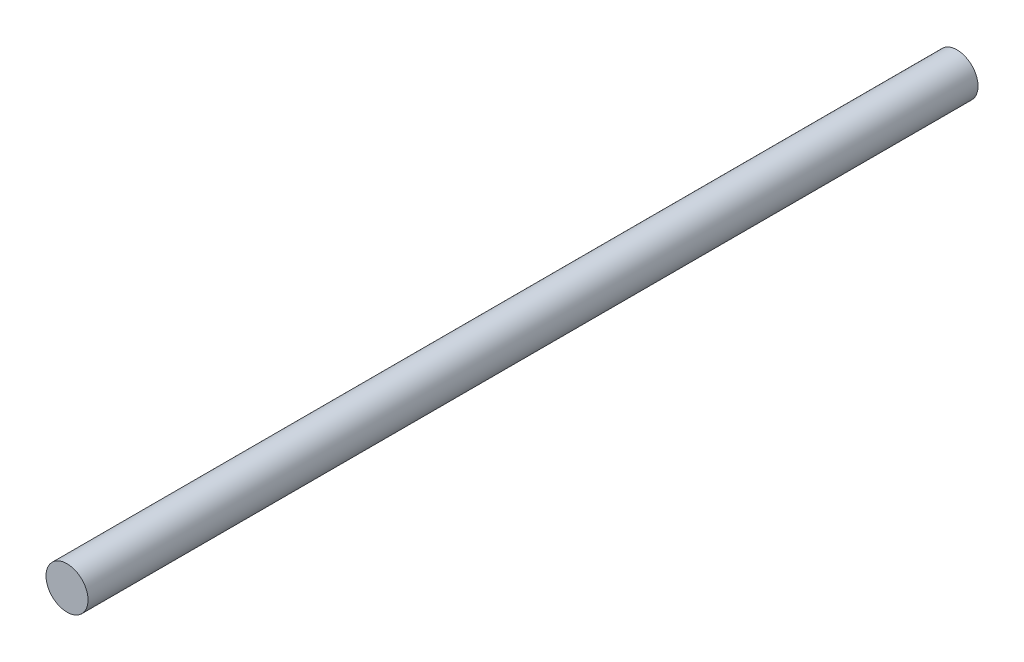
ISO-10303-21;
HEADER;
FILE_DESCRIPTION(('STEP AP214'),'2;1');
FILE_NAME('part.step','',(''),(''),'','','');
FILE_SCHEMA(('AUTOMOTIVE_DESIGN { 1 0 10303 214 1 1 1 1 }'));
ENDSEC;
DATA;
#1=APPLICATION_CONTEXT('core data for automotive mechanical design processes');
#2=APPLICATION_PROTOCOL_DEFINITION('international standard','automotive_design',2000,#1);
#3=PRODUCT_CONTEXT('',#1,'mechanical');
#4=PRODUCT('Part','Part','',(#3));
#5=PRODUCT_RELATED_PRODUCT_CATEGORY('part','',(#4));
#6=PRODUCT_DEFINITION_FORMATION('','',#4);
#7=PRODUCT_DEFINITION_CONTEXT('part definition',#1,'design');
#8=PRODUCT_DEFINITION('design','',#6,#7);
#9=PRODUCT_DEFINITION_SHAPE('','',#8);
#10=(LENGTH_UNIT() NAMED_UNIT(*) SI_UNIT(.MILLI.,.METRE.));
#11=(NAMED_UNIT(*) PLANE_ANGLE_UNIT() SI_UNIT($,.RADIAN.));
#12=(NAMED_UNIT(*) SI_UNIT($,.STERADIAN.) SOLID_ANGLE_UNIT());
#13=UNCERTAINTY_MEASURE_WITH_UNIT(LENGTH_MEASURE(1.E-05),#10,'distance_accuracy_value','');
#14=(GEOMETRIC_REPRESENTATION_CONTEXT(3) GLOBAL_UNCERTAINTY_ASSIGNED_CONTEXT((#13)) GLOBAL_UNIT_ASSIGNED_CONTEXT((#10,
#11,#12)) REPRESENTATION_CONTEXT('',''));
#15=CARTESIAN_POINT('',(0.,0.,0.));
#16=DIRECTION('',(0.,0.,1.));
#17=DIRECTION('',(1.,0.,0.));
#18=AXIS2_PLACEMENT_3D('',#15,#16,#17);
#19=CARTESIAN_POINT('',(0.,0.,360.));
#20=DIRECTION('',(0.,0.,-1.));
#21=DIRECTION('',(-1.,0.,0.));
#22=AXIS2_PLACEMENT_3D('',#19,#20,#21);
#23=CYLINDRICAL_SURFACE('',#22,8.5);
#24=CARTESIAN_POINT('',(0.,0.,360.));
#25=DIRECTION('',(0.,0.,1.));
#26=DIRECTION('',(1.,0.,0.));
#27=AXIS2_PLACEMENT_3D('',#24,#25,#26);
#28=CIRCLE('',#27,8.5);
#29=CARTESIAN_POINT('',(-8.5,0.,360.));
#30=VERTEX_POINT('',#29);
#31=EDGE_CURVE('E10',#30,#30,#28,.T.);
#32=CARTESIAN_POINT('',(0.,0.,0.));
#33=DIRECTION('',(0.,0.,1.));
#34=DIRECTION('',(1.,0.,0.));
#35=AXIS2_PLACEMENT_3D('',#32,#33,#34);
#36=CIRCLE('',#35,8.5);
#37=CARTESIAN_POINT('',(-8.5,0.,0.));
#38=VERTEX_POINT('',#37);
#39=EDGE_CURVE('E39',#38,#38,#36,.T.);
#40=CARTESIAN_POINT('',(-8.5,0.,360.));
#41=CARTESIAN_POINT('',(-8.5,0.,356.25));
#42=CARTESIAN_POINT('',(-8.5,0.,352.5));
#43=CARTESIAN_POINT('',(-8.5,0.,345.));
#44=CARTESIAN_POINT('',(-8.5,0.,341.25));
#45=CARTESIAN_POINT('',(-8.5,0.,333.75));
#46=CARTESIAN_POINT('',(-8.5,0.,330.));
#47=CARTESIAN_POINT('',(-8.5,0.,322.5));
#48=CARTESIAN_POINT('',(-8.5,0.,318.75));
#49=CARTESIAN_POINT('',(-8.5,0.,311.25));
#50=CARTESIAN_POINT('',(-8.5,0.,307.5));
#51=CARTESIAN_POINT('',(-8.5,0.,300.));
#52=CARTESIAN_POINT('',(-8.5,0.,296.25));
#53=CARTESIAN_POINT('',(-8.5,0.,288.75));
#54=CARTESIAN_POINT('',(-8.5,0.,285.));
#55=CARTESIAN_POINT('',(-8.5,0.,277.5));
#56=CARTESIAN_POINT('',(-8.5,0.,273.75));
#57=CARTESIAN_POINT('',(-8.5,0.,266.25));
#58=CARTESIAN_POINT('',(-8.5,0.,262.5));
#59=CARTESIAN_POINT('',(-8.5,0.,255.));
#60=CARTESIAN_POINT('',(-8.5,0.,251.25));
#61=CARTESIAN_POINT('',(-8.5,0.,243.75));
#62=CARTESIAN_POINT('',(-8.5,0.,240.));
#63=CARTESIAN_POINT('',(-8.5,0.,232.5));
#64=CARTESIAN_POINT('',(-8.5,0.,228.75));
#65=CARTESIAN_POINT('',(-8.5,0.,221.25));
#66=CARTESIAN_POINT('',(-8.5,0.,217.5));
#67=CARTESIAN_POINT('',(-8.5,0.,210.));
#68=CARTESIAN_POINT('',(-8.5,0.,206.25));
#69=CARTESIAN_POINT('',(-8.5,0.,198.75));
#70=CARTESIAN_POINT('',(-8.5,0.,195.));
#71=CARTESIAN_POINT('',(-8.5,0.,187.5));
#72=CARTESIAN_POINT('',(-8.5,0.,183.75));
#73=CARTESIAN_POINT('',(-8.5,0.,176.25));
#74=CARTESIAN_POINT('',(-8.5,0.,172.5));
#75=CARTESIAN_POINT('',(-8.5,0.,165.));
#76=CARTESIAN_POINT('',(-8.5,0.,161.25));
#77=CARTESIAN_POINT('',(-8.5,0.,153.75));
#78=CARTESIAN_POINT('',(-8.5,0.,150.));
#79=CARTESIAN_POINT('',(-8.5,0.,142.5));
#80=CARTESIAN_POINT('',(-8.5,0.,138.75));
#81=CARTESIAN_POINT('',(-8.5,0.,131.25));
#82=CARTESIAN_POINT('',(-8.5,0.,127.5));
#83=CARTESIAN_POINT('',(-8.5,0.,120.));
#84=CARTESIAN_POINT('',(-8.5,0.,116.25));
#85=CARTESIAN_POINT('',(-8.5,0.,108.75));
#86=CARTESIAN_POINT('',(-8.5,0.,105.));
#87=CARTESIAN_POINT('',(-8.5,0.,97.5));
#88=CARTESIAN_POINT('',(-8.5,0.,93.75));
#89=CARTESIAN_POINT('',(-8.5,0.,86.25));
#90=CARTESIAN_POINT('',(-8.5,0.,82.4999999999999));
#91=CARTESIAN_POINT('',(-8.5,0.,74.9999999999999));
#92=CARTESIAN_POINT('',(-8.5,0.,71.2499999999999));
#93=CARTESIAN_POINT('',(-8.5,0.,63.75));
#94=CARTESIAN_POINT('',(-8.5,0.,60.));
#95=CARTESIAN_POINT('',(-8.5,0.,52.5));
#96=CARTESIAN_POINT('',(-8.5,0.,48.7499999999999));
#97=CARTESIAN_POINT('',(-8.5,0.,41.2499999999999));
#98=CARTESIAN_POINT('',(-8.5,0.,37.4999999999999));
#99=CARTESIAN_POINT('',(-8.5,0.,30.));
#100=CARTESIAN_POINT('',(-8.5,0.,26.25));
#101=CARTESIAN_POINT('',(-8.5,0.,18.75));
#102=CARTESIAN_POINT('',(-8.5,0.,14.9999999999999));
#103=CARTESIAN_POINT('',(-8.5,0.,7.49999999999993));
#104=CARTESIAN_POINT('',(-8.5,0.,3.74999999999994));
#105=CARTESIAN_POINT('',(-8.5,0.,0.));
#106=B_SPLINE_CURVE_WITH_KNOTS('',3,(#40,#41,#42,#43,#44,#45,#46,#47,#48,#49,#50,#51,#52,#53,
#54,#55,#56,#57,#58,#59,#60,#61,#62,#63,#64,#65,#66,#67,#68,#69,#70,#71,#72,#73,#74,#75,#76,#77,
#78,#79,#80,#81,#82,#83,#84,#85,#86,#87,#88,#89,#90,#91,#92,#93,#94,#95,#96,#97,#98,#99,#100,
#101,#102,#103,#104,#105),.UNSPECIFIED.,.F.,.F.,(4,2,2,2,2,2,2,2,2,2,2,2,2,2,2,2,2,2,2,2,2,2,2,
2,2,2,2,2,2,2,2,2,4),(0.,11.25,22.5,33.7499999999999,45.,56.25,67.4999999999999,78.75,90.,
101.25,112.5,123.75,135.,146.25,157.5,168.75,180.,191.25,202.5,213.75,225.,236.25,247.5,258.75,
270.,281.25,292.5,303.75,315.,326.25,337.5,348.75,360.),.UNSPECIFIED.);
#107=EDGE_CURVE('BSEAM36',#30,#38,#106,.T.);
#108=ORIENTED_EDGE('',*,*,#31,.F.);
#109=ORIENTED_EDGE('',*,*,#39,.T.);
#110=ORIENTED_EDGE('',*,*,#107,.T.);
#111=ORIENTED_EDGE('',*,*,#107,.F.);
#112=EDGE_LOOP('',(#108,#110,#109,#111));
#113=FACE_BOUND('',#112,.T.);
#114=ADVANCED_FACE('F36',(#113),#23,.T.);
#115=CARTESIAN_POINT('',(0.,0.,360.));
#116=DIRECTION('',(0.,0.,1.));
#117=DIRECTION('',(1.,0.,0.));
#118=AXIS2_PLACEMENT_3D('',#115,#116,#117);
#119=PLANE('',#118);
#120=ORIENTED_EDGE('',*,*,#31,.T.);
#121=EDGE_LOOP('',(#120));
#122=FACE_BOUND('',#121,.T.);
#123=ADVANCED_FACE('F51',(#122),#119,.T.);
#124=CARTESIAN_POINT('',(0.,0.,0.));
#125=DIRECTION('',(0.,0.,1.));
#126=DIRECTION('',(1.,0.,0.));
#127=AXIS2_PLACEMENT_3D('',#124,#125,#126);
#128=PLANE('',#127);
#129=ORIENTED_EDGE('',*,*,#39,.F.);
#130=EDGE_LOOP('',(#129));
#131=FACE_BOUND('',#130,.T.);
#132=ADVANCED_FACE('F49',(#131),#128,.F.);
#133=CLOSED_SHELL('',(#114,#123,#132));
#134=MANIFOLD_SOLID_BREP('B2',#133);
#135=ADVANCED_BREP_SHAPE_REPRESENTATION('',(#18,#134),#14);
#136=SHAPE_DEFINITION_REPRESENTATION(#9,#135);
ENDSEC;
END-ISO-10303-21;
